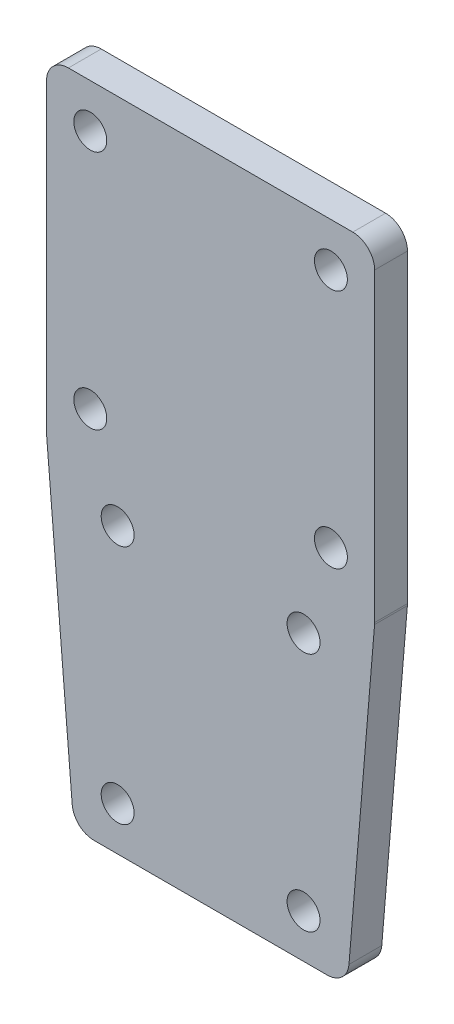
ISO-10303-21;
HEADER;
FILE_DESCRIPTION(('STEP AP214'),'2;1');
FILE_NAME('part.step','',(''),(''),'','','');
FILE_SCHEMA(('AUTOMOTIVE_DESIGN { 1 0 10303 214 1 1 1 1 }'));
ENDSEC;
DATA;
#1=APPLICATION_CONTEXT('core data for automotive mechanical design processes');
#2=APPLICATION_PROTOCOL_DEFINITION('international standard','automotive_design',2000,#1);
#3=PRODUCT_CONTEXT('',#1,'mechanical');
#4=PRODUCT('Part','Part','',(#3));
#5=PRODUCT_RELATED_PRODUCT_CATEGORY('part','',(#4));
#6=PRODUCT_DEFINITION_FORMATION('','',#4);
#7=PRODUCT_DEFINITION_CONTEXT('part definition',#1,'design');
#8=PRODUCT_DEFINITION('design','',#6,#7);
#9=PRODUCT_DEFINITION_SHAPE('','',#8);
#10=(LENGTH_UNIT() NAMED_UNIT(*) SI_UNIT(.MILLI.,.METRE.));
#11=(NAMED_UNIT(*) PLANE_ANGLE_UNIT() SI_UNIT($,.RADIAN.));
#12=(NAMED_UNIT(*) SI_UNIT($,.STERADIAN.) SOLID_ANGLE_UNIT());
#13=UNCERTAINTY_MEASURE_WITH_UNIT(LENGTH_MEASURE(1.E-05),#10,'distance_accuracy_value','');
#14=(GEOMETRIC_REPRESENTATION_CONTEXT(3) GLOBAL_UNCERTAINTY_ASSIGNED_CONTEXT((#13)) GLOBAL_UNIT_ASSIGNED_CONTEXT((#10,
#11,#12)) REPRESENTATION_CONTEXT('',''));
#15=CARTESIAN_POINT('',(0.,0.,0.));
#16=DIRECTION('',(0.,0.,1.));
#17=DIRECTION('',(1.,0.,0.));
#18=AXIS2_PLACEMENT_3D('',#15,#16,#17);
#19=CARTESIAN_POINT('',(0.,-45.,1.5));
#20=DIRECTION('',(0.,1.,0.));
#21=DIRECTION('',(0.,0.,1.));
#22=AXIS2_PLACEMENT_3D('',#19,#20,#21);
#23=PLANE('',#22);
#24=DIRECTION('',(1.,0.,0.));
#25=VECTOR('',#24,1.);
#26=CARTESIAN_POINT('',(0.,-45.,-1.5));
#27=LINE('',#26,#25);
#28=CARTESIAN_POINT('',(-10.659734236868,-45.,-1.5));
#29=VERTEX_POINT('',#28);
#30=CARTESIAN_POINT('',(10.659734236868,-45.,-1.5));
#31=VERTEX_POINT('',#30);
#32=EDGE_CURVE('E132',#29,#31,#27,.T.);
#33=ORIENTED_EDGE('',*,*,#32,.T.);
#34=DIRECTION('',(0.,0.,-1.));
#35=VECTOR('',#34,1.);
#36=CARTESIAN_POINT('',(10.659734236868,-45.,1.5));
#37=LINE('',#36,#35);
#38=CARTESIAN_POINT('',(10.659734236868,-45.,1.5));
#39=VERTEX_POINT('',#38);
#40=EDGE_CURVE('E11',#31,#39,#37,.F.);
#41=ORIENTED_EDGE('',*,*,#40,.T.);
#42=DIRECTION('',(1.,0.,0.));
#43=VECTOR('',#42,1.);
#44=CARTESIAN_POINT('',(0.,-45.,1.5));
#45=LINE('',#44,#43);
#46=CARTESIAN_POINT('',(-10.659734236868,-45.,1.5));
#47=VERTEX_POINT('',#46);
#48=EDGE_CURVE('E202',#47,#39,#45,.T.);
#49=ORIENTED_EDGE('',*,*,#48,.F.);
#50=DIRECTION('',(0.,0.,-1.));
#51=VECTOR('',#50,1.);
#52=CARTESIAN_POINT('',(-10.659734236868,-45.,-1.5));
#53=LINE('',#52,#51);
#54=EDGE_CURVE('E45',#47,#29,#53,.T.);
#55=ORIENTED_EDGE('',*,*,#54,.T.);
#56=EDGE_LOOP('',(#33,#41,#49,#55));
#57=FACE_BOUND('',#56,.T.);
#58=ADVANCED_FACE('F37',(#57),#23,.F.);
#59=CARTESIAN_POINT('',(15.,0.,1.5));
#60=DIRECTION('',(-1.,0.,0.));
#61=DIRECTION('',(0.,0.,1.));
#62=AXIS2_PLACEMENT_3D('',#59,#60,#61);
#63=PLANE('',#62);
#64=DIRECTION('',(0.,1.,0.));
#65=VECTOR('',#64,1.);
#66=CARTESIAN_POINT('',(15.,0.,-1.5));
#67=LINE('',#66,#65);
#68=CARTESIAN_POINT('',(15.,-14.9168108424154,-1.5));
#69=VERTEX_POINT('',#68);
#70=CARTESIAN_POINT('',(15.,13.,-1.5));
#71=VERTEX_POINT('',#70);
#72=EDGE_CURVE('E213',#69,#71,#67,.T.);
#73=ORIENTED_EDGE('',*,*,#72,.T.);
#74=DIRECTION('',(0.,0.,-1.));
#75=VECTOR('',#74,1.);
#76=CARTESIAN_POINT('',(15.,13.,1.5));
#77=LINE('',#76,#75);
#78=CARTESIAN_POINT('',(15.,13.,1.5));
#79=VERTEX_POINT('',#78);
#80=EDGE_CURVE('E192',#71,#79,#77,.F.);
#81=ORIENTED_EDGE('',*,*,#80,.T.);
#82=DIRECTION('',(0.,1.,0.));
#83=VECTOR('',#82,1.);
#84=CARTESIAN_POINT('',(15.,0.,1.5));
#85=LINE('',#84,#83);
#86=CARTESIAN_POINT('',(15.,-14.9168108424154,1.5));
#87=VERTEX_POINT('',#86);
#88=EDGE_CURVE('E204',#87,#79,#85,.T.);
#89=ORIENTED_EDGE('',*,*,#88,.F.);
#90=DIRECTION('',(0.,0.,-1.));
#91=VECTOR('',#90,1.);
#92=CARTESIAN_POINT('',(15.,-14.9168108424154,-1.5));
#93=LINE('',#92,#91);
#94=EDGE_CURVE('E189',#87,#69,#93,.T.);
#95=ORIENTED_EDGE('',*,*,#94,.T.);
#96=EDGE_LOOP('',(#73,#81,#89,#95));
#97=FACE_BOUND('',#96,.T.);
#98=ADVANCED_FACE('F323',(#97),#63,.F.);
#99=CARTESIAN_POINT('',(0.,15.,1.5));
#100=DIRECTION('',(0.,1.,0.));
#101=DIRECTION('',(0.,0.,1.));
#102=AXIS2_PLACEMENT_3D('',#99,#100,#101);
#103=PLANE('',#102);
#104=DIRECTION('',(1.,0.,0.));
#105=VECTOR('',#104,1.);
#106=CARTESIAN_POINT('',(0.,15.,-1.5));
#107=LINE('',#106,#105);
#108=CARTESIAN_POINT('',(-13.,15.,-1.5));
#109=VERTEX_POINT('',#108);
#110=CARTESIAN_POINT('',(13.,15.,-1.5));
#111=VERTEX_POINT('',#110);
#112=EDGE_CURVE('E208',#109,#111,#107,.T.);
#113=ORIENTED_EDGE('',*,*,#112,.F.);
#114=DIRECTION('',(0.,0.,-1.));
#115=VECTOR('',#114,1.);
#116=CARTESIAN_POINT('',(-13.,15.,1.5));
#117=LINE('',#116,#115);
#118=CARTESIAN_POINT('',(-13.,15.,1.5));
#119=VERTEX_POINT('',#118);
#120=EDGE_CURVE('E59',#109,#119,#117,.F.);
#121=ORIENTED_EDGE('',*,*,#120,.T.);
#122=DIRECTION('',(1.,0.,0.));
#123=VECTOR('',#122,1.);
#124=CARTESIAN_POINT('',(0.,15.,1.5));
#125=LINE('',#124,#123);
#126=CARTESIAN_POINT('',(13.,15.,1.5));
#127=VERTEX_POINT('',#126);
#128=EDGE_CURVE('E155',#119,#127,#125,.T.);
#129=ORIENTED_EDGE('',*,*,#128,.T.);
#130=DIRECTION('',(0.,0.,-1.));
#131=VECTOR('',#130,1.);
#132=CARTESIAN_POINT('',(13.,15.,-1.5));
#133=LINE('',#132,#131);
#134=EDGE_CURVE('E185',#127,#111,#133,.T.);
#135=ORIENTED_EDGE('',*,*,#134,.T.);
#136=EDGE_LOOP('',(#113,#121,#129,#135));
#137=FACE_BOUND('',#136,.T.);
#138=ADVANCED_FACE('F217',(#137),#103,.T.);
#139=CARTESIAN_POINT('',(-15.,0.,1.5));
#140=DIRECTION('',(-1.,0.,0.));
#141=DIRECTION('',(0.,0.,1.));
#142=AXIS2_PLACEMENT_3D('',#139,#140,#141);
#143=PLANE('',#142);
#144=DIRECTION('',(0.,1.,0.));
#145=VECTOR('',#144,1.);
#146=CARTESIAN_POINT('',(-15.,0.,-1.5));
#147=LINE('',#146,#145);
#148=CARTESIAN_POINT('',(-15.,-14.9168108424154,-1.5));
#149=VERTEX_POINT('',#148);
#150=CARTESIAN_POINT('',(-15.,13.,-1.5));
#151=VERTEX_POINT('',#150);
#152=EDGE_CURVE('E158',#149,#151,#147,.T.);
#153=ORIENTED_EDGE('',*,*,#152,.F.);
#154=DIRECTION('',(0.,0.,-1.));
#155=VECTOR('',#154,1.);
#156=CARTESIAN_POINT('',(-15.,-14.9168108424154,1.5));
#157=LINE('',#156,#155);
#158=CARTESIAN_POINT('',(-15.,-14.9168108424154,1.5));
#159=VERTEX_POINT('',#158);
#160=EDGE_CURVE('E173',#149,#159,#157,.F.);
#161=ORIENTED_EDGE('',*,*,#160,.T.);
#162=DIRECTION('',(0.,1.,0.));
#163=VECTOR('',#162,1.);
#164=CARTESIAN_POINT('',(-15.,0.,1.5));
#165=LINE('',#164,#163);
#166=CARTESIAN_POINT('',(-15.,13.,1.5));
#167=VERTEX_POINT('',#166);
#168=EDGE_CURVE('E151',#159,#167,#165,.T.);
#169=ORIENTED_EDGE('',*,*,#168,.T.);
#170=DIRECTION('',(0.,0.,-1.));
#171=VECTOR('',#170,1.);
#172=CARTESIAN_POINT('',(-15.,13.,1.5));
#173=LINE('',#172,#171);
#174=EDGE_CURVE('E170',#167,#151,#173,.T.);
#175=ORIENTED_EDGE('',*,*,#174,.T.);
#176=EDGE_LOOP('',(#153,#161,#169,#175));
#177=FACE_BOUND('',#176,.T.);
#178=ADVANCED_FACE('F228',(#177),#143,.T.);
#179=CARTESIAN_POINT('',(0.,0.,1.5));
#180=DIRECTION('',(0.,0.,1.));
#181=DIRECTION('',(1.,0.,0.));
#182=AXIS2_PLACEMENT_3D('',#179,#180,#181);
#183=PLANE('',#182);
#184=CARTESIAN_POINT('',(-11.,11.,1.5));
#185=DIRECTION('',(0.,0.,1.));
#186=DIRECTION('',(1.,0.,0.));
#187=AXIS2_PLACEMENT_3D('',#184,#185,#186);
#188=CIRCLE('',#187,1.505);
#189=CARTESIAN_POINT('',(-9.495,11.,1.5));
#190=VERTEX_POINT('',#189);
#191=EDGE_CURVE('E269',#190,#190,#188,.F.);
#192=ORIENTED_EDGE('',*,*,#191,.T.);
#193=EDGE_LOOP('',(#192));
#194=FACE_BOUND('',#193,.T.);
#195=CARTESIAN_POINT('',(11.,-11.,1.5));
#196=DIRECTION('',(0.,0.,1.));
#197=DIRECTION('',(1.,0.,0.));
#198=AXIS2_PLACEMENT_3D('',#195,#196,#197);
#199=CIRCLE('',#198,1.505);
#200=CARTESIAN_POINT('',(12.505,-11.,1.5));
#201=VERTEX_POINT('',#200);
#202=EDGE_CURVE('E270',#201,#201,#199,.F.);
#203=ORIENTED_EDGE('',*,*,#202,.T.);
#204=EDGE_LOOP('',(#203));
#205=FACE_BOUND('',#204,.T.);
#206=CARTESIAN_POINT('',(-11.,-11.,1.5));
#207=DIRECTION('',(0.,0.,1.));
#208=DIRECTION('',(1.,0.,0.));
#209=AXIS2_PLACEMENT_3D('',#206,#207,#208);
#210=CIRCLE('',#209,1.505);
#211=CARTESIAN_POINT('',(-9.495,-11.,1.5));
#212=VERTEX_POINT('',#211);
#213=EDGE_CURVE('E277',#212,#212,#210,.F.);
#214=ORIENTED_EDGE('',*,*,#213,.T.);
#215=EDGE_LOOP('',(#214));
#216=FACE_BOUND('',#215,.T.);
#217=CARTESIAN_POINT('',(11.,11.,1.5));
#218=DIRECTION('',(0.,0.,1.));
#219=DIRECTION('',(1.,0.,0.));
#220=AXIS2_PLACEMENT_3D('',#217,#218,#219);
#221=CIRCLE('',#220,1.505);
#222=CARTESIAN_POINT('',(12.505,11.,1.5));
#223=VERTEX_POINT('',#222);
#224=EDGE_CURVE('E263',#223,#223,#221,.F.);
#225=ORIENTED_EDGE('',*,*,#224,.T.);
#226=EDGE_LOOP('',(#225));
#227=FACE_BOUND('',#226,.T.);
#228=CARTESIAN_POINT('',(-8.5,-19.,1.5));
#229=DIRECTION('',(0.,0.,1.));
#230=DIRECTION('',(1.,0.,0.));
#231=AXIS2_PLACEMENT_3D('',#228,#229,#230);
#232=CIRCLE('',#231,1.505);
#233=CARTESIAN_POINT('',(-10.005,-19.,1.5));
#234=VERTEX_POINT('',#233);
#235=EDGE_CURVE('E245',#234,#234,#232,.F.);
#236=ORIENTED_EDGE('',*,*,#235,.T.);
#237=EDGE_LOOP('',(#236));
#238=FACE_BOUND('',#237,.T.);
#239=CARTESIAN_POINT('',(8.49999999999999,-41.,1.5));
#240=DIRECTION('',(0.,0.,1.));
#241=DIRECTION('',(1.,0.,0.));
#242=AXIS2_PLACEMENT_3D('',#239,#240,#241);
#243=CIRCLE('',#242,1.505);
#244=CARTESIAN_POINT('',(6.99499999999999,-41.,1.5));
#245=VERTEX_POINT('',#244);
#246=EDGE_CURVE('E246',#245,#245,#243,.F.);
#247=ORIENTED_EDGE('',*,*,#246,.T.);
#248=EDGE_LOOP('',(#247));
#249=FACE_BOUND('',#248,.T.);
#250=CARTESIAN_POINT('',(-8.5,-41.,1.5));
#251=DIRECTION('',(0.,0.,1.));
#252=DIRECTION('',(1.,0.,0.));
#253=AXIS2_PLACEMENT_3D('',#250,#251,#252);
#254=CIRCLE('',#253,1.505);
#255=CARTESIAN_POINT('',(-10.005,-41.,1.5));
#256=VERTEX_POINT('',#255);
#257=EDGE_CURVE('E253',#256,#256,#254,.F.);
#258=ORIENTED_EDGE('',*,*,#257,.T.);
#259=EDGE_LOOP('',(#258));
#260=FACE_BOUND('',#259,.T.);
#261=CARTESIAN_POINT('',(8.5,-19.,1.5));
#262=DIRECTION('',(0.,0.,1.));
#263=DIRECTION('',(1.,0.,0.));
#264=AXIS2_PLACEMENT_3D('',#261,#262,#263);
#265=CIRCLE('',#264,1.505);
#266=CARTESIAN_POINT('',(6.995,-19.,1.5));
#267=VERTEX_POINT('',#266);
#268=EDGE_CURVE('E234',#267,#267,#265,.F.);
#269=ORIENTED_EDGE('',*,*,#268,.T.);
#270=EDGE_LOOP('',(#269));
#271=FACE_BOUND('',#270,.T.);
#272=ORIENTED_EDGE('',*,*,#168,.F.);
#273=CARTESIAN_POINT('',(-13.,-14.9168108424154,1.5));
#274=DIRECTION('',(0.,0.,1.));
#275=DIRECTION('',(1.,0.,0.));
#276=AXIS2_PLACEMENT_3D('',#273,#274,#275);
#277=CIRCLE('',#276,2.);
#278=CARTESIAN_POINT('',(-14.9930915164898,-15.0829018021229,1.5));
#279=VERTEX_POINT('',#278);
#280=EDGE_CURVE('E183',#159,#279,#277,.T.);
#281=ORIENTED_EDGE('',*,*,#280,.T.);
#282=DIRECTION('',(0.0830454798537399,-0.99654575824488,0.));
#283=VECTOR('',#282,1.);
#284=CARTESIAN_POINT('',(-15.,-15.,1.5));
#285=LINE('',#284,#283);
#286=CARTESIAN_POINT('',(-12.6528257533577,-43.1660909597075,1.5));
#287=VERTEX_POINT('',#286);
#288=EDGE_CURVE('E232',#279,#287,#285,.T.);
#289=ORIENTED_EDGE('',*,*,#288,.T.);
#290=CARTESIAN_POINT('',(-10.659734236868,-43.,1.5));
#291=DIRECTION('',(0.,0.,1.));
#292=DIRECTION('',(1.,0.,0.));
#293=AXIS2_PLACEMENT_3D('',#290,#291,#292);
#294=CIRCLE('',#293,2.);
#295=EDGE_CURVE('E150',#287,#47,#294,.T.);
#296=ORIENTED_EDGE('',*,*,#295,.T.);
#297=ORIENTED_EDGE('',*,*,#48,.T.);
#298=CARTESIAN_POINT('',(10.659734236868,-43.,1.5));
#299=DIRECTION('',(0.,0.,1.));
#300=DIRECTION('',(1.,0.,0.));
#301=AXIS2_PLACEMENT_3D('',#298,#299,#300);
#302=CIRCLE('',#301,2.);
#303=CARTESIAN_POINT('',(12.6528257533577,-43.1660909597075,1.5));
#304=VERTEX_POINT('',#303);
#305=EDGE_CURVE('E176',#39,#304,#302,.T.);
#306=ORIENTED_EDGE('',*,*,#305,.T.);
#307=DIRECTION('',(0.0830454798537399,0.99654575824488,0.));
#308=VECTOR('',#307,1.);
#309=CARTESIAN_POINT('',(12.5,-45.,1.5));
#310=LINE('',#309,#308);
#311=CARTESIAN_POINT('',(14.9930915164898,-15.0829018021229,1.5));
#312=VERTEX_POINT('',#311);
#313=EDGE_CURVE('E233',#304,#312,#310,.T.);
#314=ORIENTED_EDGE('',*,*,#313,.T.);
#315=CARTESIAN_POINT('',(13.,-14.9168108424154,1.5));
#316=DIRECTION('',(0.,0.,1.));
#317=DIRECTION('',(1.,0.,0.));
#318=AXIS2_PLACEMENT_3D('',#315,#316,#317);
#319=CIRCLE('',#318,2.);
#320=EDGE_CURVE('E178',#312,#87,#319,.T.);
#321=ORIENTED_EDGE('',*,*,#320,.T.);
#322=ORIENTED_EDGE('',*,*,#88,.T.);
#323=CARTESIAN_POINT('',(13.,13.,1.5));
#324=DIRECTION('',(0.,0.,1.));
#325=DIRECTION('',(1.,0.,0.));
#326=AXIS2_PLACEMENT_3D('',#323,#324,#325);
#327=CIRCLE('',#326,2.);
#328=EDGE_CURVE('E52',#79,#127,#327,.T.);
#329=ORIENTED_EDGE('',*,*,#328,.T.);
#330=ORIENTED_EDGE('',*,*,#128,.F.);
#331=CARTESIAN_POINT('',(-13.,13.,1.5));
#332=DIRECTION('',(0.,0.,1.));
#333=DIRECTION('',(1.,0.,0.));
#334=AXIS2_PLACEMENT_3D('',#331,#332,#333);
#335=CIRCLE('',#334,2.);
#336=EDGE_CURVE('E181',#119,#167,#335,.T.);
#337=ORIENTED_EDGE('',*,*,#336,.T.);
#338=EDGE_LOOP('',(#272,#281,#289,#296,#297,#306,#314,#321,#322,#329,#330,#337));
#339=FACE_BOUND('',#338,.T.);
#340=ADVANCED_FACE('F224',(#194,#205,#216,#227,#238,#249,#260,#271,#339),#183,.T.);
#341=CARTESIAN_POINT('',(0.,0.,-1.5));
#342=DIRECTION('',(0.,0.,1.));
#343=DIRECTION('',(1.,0.,0.));
#344=AXIS2_PLACEMENT_3D('',#341,#342,#343);
#345=PLANE('',#344);
#346=CARTESIAN_POINT('',(-11.,11.,-1.5));
#347=DIRECTION('',(0.,0.,-1.));
#348=DIRECTION('',(-1.,0.,0.));
#349=AXIS2_PLACEMENT_3D('',#346,#347,#348);
#350=CIRCLE('',#349,1.505);
#351=CARTESIAN_POINT('',(-12.505,11.,-1.5));
#352=VERTEX_POINT('',#351);
#353=EDGE_CURVE('E273',#352,#352,#350,.T.);
#354=ORIENTED_EDGE('',*,*,#353,.F.);
#355=EDGE_LOOP('',(#354));
#356=FACE_BOUND('',#355,.T.);
#357=CARTESIAN_POINT('',(11.,-11.,-1.5));
#358=DIRECTION('',(0.,0.,-1.));
#359=DIRECTION('',(-1.,0.,0.));
#360=AXIS2_PLACEMENT_3D('',#357,#358,#359);
#361=CIRCLE('',#360,1.505);
#362=CARTESIAN_POINT('',(9.495,-11.,-1.5));
#363=VERTEX_POINT('',#362);
#364=EDGE_CURVE('E274',#363,#363,#361,.T.);
#365=ORIENTED_EDGE('',*,*,#364,.F.);
#366=EDGE_LOOP('',(#365));
#367=FACE_BOUND('',#366,.T.);
#368=CARTESIAN_POINT('',(-11.,-11.,-1.5));
#369=DIRECTION('',(0.,0.,-1.));
#370=DIRECTION('',(-1.,0.,0.));
#371=AXIS2_PLACEMENT_3D('',#368,#369,#370);
#372=CIRCLE('',#371,1.505);
#373=CARTESIAN_POINT('',(-12.505,-11.,-1.5));
#374=VERTEX_POINT('',#373);
#375=EDGE_CURVE('E284',#374,#374,#372,.T.);
#376=ORIENTED_EDGE('',*,*,#375,.F.);
#377=EDGE_LOOP('',(#376));
#378=FACE_BOUND('',#377,.T.);
#379=CARTESIAN_POINT('',(11.,11.,-1.5));
#380=DIRECTION('',(0.,0.,-1.));
#381=DIRECTION('',(-1.,0.,0.));
#382=AXIS2_PLACEMENT_3D('',#379,#380,#381);
#383=CIRCLE('',#382,1.505);
#384=CARTESIAN_POINT('',(9.495,11.,-1.5));
#385=VERTEX_POINT('',#384);
#386=EDGE_CURVE('E266',#385,#385,#383,.T.);
#387=ORIENTED_EDGE('',*,*,#386,.F.);
#388=EDGE_LOOP('',(#387));
#389=FACE_BOUND('',#388,.T.);
#390=CARTESIAN_POINT('',(-8.5,-19.,-1.5));
#391=DIRECTION('',(0.,0.,-1.));
#392=DIRECTION('',(-1.,0.,0.));
#393=AXIS2_PLACEMENT_3D('',#390,#391,#392);
#394=CIRCLE('',#393,1.505);
#395=CARTESIAN_POINT('',(-10.005,-19.,-1.5));
#396=VERTEX_POINT('',#395);
#397=EDGE_CURVE('E249',#396,#396,#394,.T.);
#398=ORIENTED_EDGE('',*,*,#397,.F.);
#399=EDGE_LOOP('',(#398));
#400=FACE_BOUND('',#399,.T.);
#401=CARTESIAN_POINT('',(8.49999999999999,-41.,-1.5));
#402=DIRECTION('',(0.,0.,-1.));
#403=DIRECTION('',(-1.,0.,0.));
#404=AXIS2_PLACEMENT_3D('',#401,#402,#403);
#405=CIRCLE('',#404,1.505);
#406=CARTESIAN_POINT('',(6.99499999999999,-41.,-1.5));
#407=VERTEX_POINT('',#406);
#408=EDGE_CURVE('E250',#407,#407,#405,.T.);
#409=ORIENTED_EDGE('',*,*,#408,.F.);
#410=EDGE_LOOP('',(#409));
#411=FACE_BOUND('',#410,.T.);
#412=CARTESIAN_POINT('',(-8.5,-41.,-1.5));
#413=DIRECTION('',(0.,0.,-1.));
#414=DIRECTION('',(-1.,0.,0.));
#415=AXIS2_PLACEMENT_3D('',#412,#413,#414);
#416=CIRCLE('',#415,1.505);
#417=CARTESIAN_POINT('',(-10.005,-41.,-1.5));
#418=VERTEX_POINT('',#417);
#419=EDGE_CURVE('E260',#418,#418,#416,.T.);
#420=ORIENTED_EDGE('',*,*,#419,.F.);
#421=EDGE_LOOP('',(#420));
#422=FACE_BOUND('',#421,.T.);
#423=CARTESIAN_POINT('',(8.5,-19.,-1.5));
#424=DIRECTION('',(0.,0.,-1.));
#425=DIRECTION('',(-1.,0.,0.));
#426=AXIS2_PLACEMENT_3D('',#423,#424,#425);
#427=CIRCLE('',#426,1.505);
#428=CARTESIAN_POINT('',(6.995,-19.,-1.5));
#429=VERTEX_POINT('',#428);
#430=EDGE_CURVE('E238',#429,#429,#427,.T.);
#431=ORIENTED_EDGE('',*,*,#430,.F.);
#432=EDGE_LOOP('',(#431));
#433=FACE_BOUND('',#432,.T.);
#434=DIRECTION('',(-0.0830454798537399,0.99654575824488,0.));
#435=VECTOR('',#434,1.);
#436=CARTESIAN_POINT('',(-15.,-15.,-1.5));
#437=LINE('',#436,#435);
#438=CARTESIAN_POINT('',(-12.6528257533577,-43.1660909597075,-1.5));
#439=VERTEX_POINT('',#438);
#440=CARTESIAN_POINT('',(-14.9930915164898,-15.0829018021229,-1.5));
#441=VERTEX_POINT('',#440);
#442=EDGE_CURVE('E130',#439,#441,#437,.T.);
#443=ORIENTED_EDGE('',*,*,#442,.T.);
#444=CARTESIAN_POINT('',(-13.,-14.9168108424154,-1.5));
#445=DIRECTION('',(0.,0.,1.));
#446=DIRECTION('',(1.,0.,0.));
#447=AXIS2_PLACEMENT_3D('',#444,#445,#446);
#448=CIRCLE('',#447,2.);
#449=EDGE_CURVE('E168',#441,#149,#448,.F.);
#450=ORIENTED_EDGE('',*,*,#449,.T.);
#451=ORIENTED_EDGE('',*,*,#152,.T.);
#452=CARTESIAN_POINT('',(-13.,13.,-1.5));
#453=DIRECTION('',(0.,0.,1.));
#454=DIRECTION('',(1.,0.,0.));
#455=AXIS2_PLACEMENT_3D('',#452,#453,#454);
#456=CIRCLE('',#455,2.);
#457=EDGE_CURVE('E166',#151,#109,#456,.F.);
#458=ORIENTED_EDGE('',*,*,#457,.T.);
#459=ORIENTED_EDGE('',*,*,#112,.T.);
#460=CARTESIAN_POINT('',(13.,13.,-1.5));
#461=DIRECTION('',(0.,0.,1.));
#462=DIRECTION('',(1.,0.,0.));
#463=AXIS2_PLACEMENT_3D('',#460,#461,#462);
#464=CIRCLE('',#463,2.);
#465=EDGE_CURVE('E164',#111,#71,#464,.F.);
#466=ORIENTED_EDGE('',*,*,#465,.T.);
#467=ORIENTED_EDGE('',*,*,#72,.F.);
#468=CARTESIAN_POINT('',(13.,-14.9168108424154,-1.5));
#469=DIRECTION('',(0.,0.,1.));
#470=DIRECTION('',(1.,0.,0.));
#471=AXIS2_PLACEMENT_3D('',#468,#469,#470);
#472=CIRCLE('',#471,2.);
#473=CARTESIAN_POINT('',(14.9930915164898,-15.0829018021229,-1.5));
#474=VERTEX_POINT('',#473);
#475=EDGE_CURVE('E162',#69,#474,#472,.F.);
#476=ORIENTED_EDGE('',*,*,#475,.T.);
#477=DIRECTION('',(-0.0830454798537399,-0.99654575824488,0.));
#478=VECTOR('',#477,1.);
#479=CARTESIAN_POINT('',(12.5,-45.,-1.5));
#480=LINE('',#479,#478);
#481=CARTESIAN_POINT('',(12.6528257533577,-43.1660909597075,-1.5));
#482=VERTEX_POINT('',#481);
#483=EDGE_CURVE('E147',#474,#482,#480,.T.);
#484=ORIENTED_EDGE('',*,*,#483,.T.);
#485=CARTESIAN_POINT('',(10.659734236868,-43.,-1.5));
#486=DIRECTION('',(0.,0.,1.));
#487=DIRECTION('',(1.,0.,0.));
#488=AXIS2_PLACEMENT_3D('',#485,#486,#487);
#489=CIRCLE('',#488,2.);
#490=EDGE_CURVE('E137',#482,#31,#489,.F.);
#491=ORIENTED_EDGE('',*,*,#490,.T.);
#492=ORIENTED_EDGE('',*,*,#32,.F.);
#493=CARTESIAN_POINT('',(-10.659734236868,-43.,-1.5));
#494=DIRECTION('',(0.,0.,1.));
#495=DIRECTION('',(1.,0.,0.));
#496=AXIS2_PLACEMENT_3D('',#493,#494,#495);
#497=CIRCLE('',#496,2.);
#498=EDGE_CURVE('E127',#29,#439,#497,.F.);
#499=ORIENTED_EDGE('',*,*,#498,.T.);
#500=EDGE_LOOP('',(#443,#450,#451,#458,#459,#466,#467,#476,#484,#491,#492,#499));
#501=FACE_BOUND('',#500,.T.);
#502=ADVANCED_FACE('F129',(#356,#367,#378,#389,#400,#411,#422,#433,#501),#345,.F.);
#503=CARTESIAN_POINT('',(-15.,-15.,-43.9264068711929));
#504=DIRECTION('',(-0.99654575824488,-0.0830454798537399,0.));
#505=DIRECTION('',(0.0830454798537399,-0.99654575824488,0.));
#506=AXIS2_PLACEMENT_3D('',#503,#504,#505);
#507=PLANE('',#506);
#508=ORIENTED_EDGE('',*,*,#288,.F.);
#509=DIRECTION('',(0.,0.,-1.));
#510=VECTOR('',#509,1.);
#511=CARTESIAN_POINT('',(-14.9930915164898,-15.0829018021229,-43.9264068711929));
#512=LINE('',#511,#510);
#513=EDGE_CURVE('E138',#279,#441,#512,.T.);
#514=ORIENTED_EDGE('',*,*,#513,.T.);
#515=ORIENTED_EDGE('',*,*,#442,.F.);
#516=DIRECTION('',(0.,0.,-1.));
#517=VECTOR('',#516,1.);
#518=CARTESIAN_POINT('',(-12.6528257533577,-43.1660909597075,1.5));
#519=LINE('',#518,#517);
#520=EDGE_CURVE('E144',#439,#287,#519,.F.);
#521=ORIENTED_EDGE('',*,*,#520,.T.);
#522=EDGE_LOOP('',(#508,#514,#515,#521));
#523=FACE_BOUND('',#522,.T.);
#524=ADVANCED_FACE('F143',(#523),#507,.T.);
#525=CARTESIAN_POINT('',(12.5,-45.,-43.9264068711929));
#526=DIRECTION('',(0.99654575824488,-0.0830454798537399,0.));
#527=DIRECTION('',(0.0830454798537399,0.99654575824488,0.));
#528=AXIS2_PLACEMENT_3D('',#525,#526,#527);
#529=PLANE('',#528);
#530=ORIENTED_EDGE('',*,*,#483,.F.);
#531=DIRECTION('',(0.,0.,-1.));
#532=VECTOR('',#531,1.);
#533=CARTESIAN_POINT('',(14.9930915164898,-15.0829018021229,1.5));
#534=LINE('',#533,#532);
#535=EDGE_CURVE('E197',#474,#312,#534,.F.);
#536=ORIENTED_EDGE('',*,*,#535,.T.);
#537=ORIENTED_EDGE('',*,*,#313,.F.);
#538=DIRECTION('',(0.,0.,-1.));
#539=VECTOR('',#538,1.);
#540=CARTESIAN_POINT('',(12.6528257533577,-43.1660909597075,-1.5));
#541=LINE('',#540,#539);
#542=EDGE_CURVE('E194',#304,#482,#541,.T.);
#543=ORIENTED_EDGE('',*,*,#542,.T.);
#544=EDGE_LOOP('',(#530,#536,#537,#543));
#545=FACE_BOUND('',#544,.T.);
#546=ADVANCED_FACE('F309',(#545),#529,.T.);
#547=CARTESIAN_POINT('',(8.5,-19.,5.75678282274303));
#548=DIRECTION('',(0.,0.,-1.));
#549=DIRECTION('',(-1.,0.,0.));
#550=AXIS2_PLACEMENT_3D('',#547,#548,#549);
#551=CYLINDRICAL_SURFACE('',#550,1.505);
#552=CARTESIAN_POINT('',(6.995,-19.,-1.5));
#553=CARTESIAN_POINT('',(6.995,-19.,-1.46875));
#554=CARTESIAN_POINT('',(6.995,-19.,-1.4375));
#555=CARTESIAN_POINT('',(6.995,-19.,-1.375));
#556=CARTESIAN_POINT('',(6.995,-19.,-1.34375));
#557=CARTESIAN_POINT('',(6.995,-19.,-1.28125));
#558=CARTESIAN_POINT('',(6.995,-19.,-1.25));
#559=CARTESIAN_POINT('',(6.995,-19.,-1.1875));
#560=CARTESIAN_POINT('',(6.995,-19.,-1.15625));
#561=CARTESIAN_POINT('',(6.995,-19.,-1.09375));
#562=CARTESIAN_POINT('',(6.995,-19.,-1.0625));
#563=CARTESIAN_POINT('',(6.995,-19.,-1.));
#564=CARTESIAN_POINT('',(6.995,-19.,-0.968750000000001));
#565=CARTESIAN_POINT('',(6.995,-19.,-0.906250000000001));
#566=CARTESIAN_POINT('',(6.995,-19.,-0.875000000000001));
#567=CARTESIAN_POINT('',(6.995,-19.,-0.812500000000001));
#568=CARTESIAN_POINT('',(6.995,-19.,-0.781250000000001));
#569=CARTESIAN_POINT('',(6.995,-19.,-0.718750000000001));
#570=CARTESIAN_POINT('',(6.995,-19.,-0.687500000000001));
#571=CARTESIAN_POINT('',(6.995,-19.,-0.625000000000001));
#572=CARTESIAN_POINT('',(6.995,-19.,-0.593750000000001));
#573=CARTESIAN_POINT('',(6.995,-19.,-0.531250000000001));
#574=CARTESIAN_POINT('',(6.995,-19.,-0.500000000000001));
#575=CARTESIAN_POINT('',(6.995,-19.,-0.437500000000001));
#576=CARTESIAN_POINT('',(6.995,-19.,-0.406250000000001));
#577=CARTESIAN_POINT('',(6.995,-19.,-0.343750000000001));
#578=CARTESIAN_POINT('',(6.995,-19.,-0.312500000000001));
#579=CARTESIAN_POINT('',(6.995,-19.,-0.250000000000001));
#580=CARTESIAN_POINT('',(6.995,-19.,-0.218750000000001));
#581=CARTESIAN_POINT('',(6.995,-19.,-0.156250000000001));
#582=CARTESIAN_POINT('',(6.995,-19.,-0.125000000000001));
#583=CARTESIAN_POINT('',(6.995,-19.,-0.0625000000000009));
#584=CARTESIAN_POINT('',(6.995,-19.,-0.0312500000000009));
#585=CARTESIAN_POINT('',(6.995,-19.,0.0312499999999992));
#586=CARTESIAN_POINT('',(6.995,-19.,0.0624999999999992));
#587=CARTESIAN_POINT('',(6.995,-19.,0.124999999999999));
#588=CARTESIAN_POINT('',(6.995,-19.,0.156249999999999));
#589=CARTESIAN_POINT('',(6.995,-19.,0.218749999999999));
#590=CARTESIAN_POINT('',(6.995,-19.,0.249999999999999));
#591=CARTESIAN_POINT('',(6.995,-19.,0.312499999999999));
#592=CARTESIAN_POINT('',(6.995,-19.,0.343749999999999));
#593=CARTESIAN_POINT('',(6.995,-19.,0.40625));
#594=CARTESIAN_POINT('',(6.995,-19.,0.4375));
#595=CARTESIAN_POINT('',(6.995,-19.,0.499999999999999));
#596=CARTESIAN_POINT('',(6.995,-19.,0.531249999999999));
#597=CARTESIAN_POINT('',(6.995,-19.,0.593749999999999));
#598=CARTESIAN_POINT('',(6.995,-19.,0.624999999999999));
#599=CARTESIAN_POINT('',(6.995,-19.,0.687499999999999));
#600=CARTESIAN_POINT('',(6.995,-19.,0.718749999999999));
#601=CARTESIAN_POINT('',(6.995,-19.,0.781249999999999));
#602=CARTESIAN_POINT('',(6.995,-19.,0.812499999999999));
#603=CARTESIAN_POINT('',(6.995,-19.,0.874999999999999));
#604=CARTESIAN_POINT('',(6.995,-19.,0.906249999999999));
#605=CARTESIAN_POINT('',(6.995,-19.,0.968749999999999));
#606=CARTESIAN_POINT('',(6.995,-19.,0.999999999999999));
#607=CARTESIAN_POINT('',(6.995,-19.,1.0625));
#608=CARTESIAN_POINT('',(6.995,-19.,1.09375));
#609=CARTESIAN_POINT('',(6.995,-19.,1.15625));
#610=CARTESIAN_POINT('',(6.995,-19.,1.1875));
#611=CARTESIAN_POINT('',(6.995,-19.,1.25));
#612=CARTESIAN_POINT('',(6.995,-19.,1.28125));
#613=CARTESIAN_POINT('',(6.995,-19.,1.34375));
#614=CARTESIAN_POINT('',(6.995,-19.,1.375));
#615=CARTESIAN_POINT('',(6.995,-19.,1.4375));
#616=CARTESIAN_POINT('',(6.995,-19.,1.46875));
#617=CARTESIAN_POINT('',(6.995,-19.,1.5));
#618=B_SPLINE_CURVE_WITH_KNOTS('',3,(#552,#553,#554,#555,#556,#557,#558,#559,#560,#561,#562,
#563,#564,#565,#566,#567,#568,#569,#570,#571,#572,#573,#574,#575,#576,#577,#578,#579,#580,#581,
#582,#583,#584,#585,#586,#587,#588,#589,#590,#591,#592,#593,#594,#595,#596,#597,#598,#599,#600,
#601,#602,#603,#604,#605,#606,#607,#608,#609,#610,#611,#612,#613,#614,#615,#616,#617),
.UNSPECIFIED.,.F.,.F.,(4,2,2,2,2,2,2,2,2,2,2,2,2,2,2,2,2,2,2,2,2,2,2,2,2,2,2,2,2,2,2,2,4),(0.,
0.0937500000000001,0.1875,0.28125,0.375,0.46875,0.5625,0.65625,0.75,0.84375,0.9375,1.03125,
1.125,1.21875,1.3125,1.40625,1.5,1.59375,1.6875,1.78125,1.875,1.96875,2.0625,2.15625,2.25,
2.34375,2.4375,2.53125,2.625,2.71875,2.8125,2.90625,3.),.UNSPECIFIED.);
#619=EDGE_CURVE('BSEAM305',#429,#267,#618,.T.);
#620=ORIENTED_EDGE('',*,*,#430,.T.);
#621=ORIENTED_EDGE('',*,*,#268,.F.);
#622=ORIENTED_EDGE('',*,*,#619,.T.);
#623=ORIENTED_EDGE('',*,*,#619,.F.);
#624=EDGE_LOOP('',(#620,#622,#621,#623));
#625=FACE_BOUND('',#624,.T.);
#626=ADVANCED_FACE('F305',(#625),#551,.F.);
#627=CARTESIAN_POINT('',(-8.5,-41.,5.75678282274303));
#628=DIRECTION('',(0.,0.,-1.));
#629=DIRECTION('',(-1.,0.,0.));
#630=AXIS2_PLACEMENT_3D('',#627,#628,#629);
#631=CYLINDRICAL_SURFACE('',#630,1.505);
#632=CARTESIAN_POINT('',(-10.005,-41.,-1.5));
#633=CARTESIAN_POINT('',(-10.005,-41.,-1.46875));
#634=CARTESIAN_POINT('',(-10.005,-41.,-1.4375));
#635=CARTESIAN_POINT('',(-10.005,-41.,-1.375));
#636=CARTESIAN_POINT('',(-10.005,-41.,-1.34375));
#637=CARTESIAN_POINT('',(-10.005,-41.,-1.28125));
#638=CARTESIAN_POINT('',(-10.005,-41.,-1.25));
#639=CARTESIAN_POINT('',(-10.005,-41.,-1.1875));
#640=CARTESIAN_POINT('',(-10.005,-41.,-1.15625));
#641=CARTESIAN_POINT('',(-10.005,-41.,-1.09375));
#642=CARTESIAN_POINT('',(-10.005,-41.,-1.0625));
#643=CARTESIAN_POINT('',(-10.005,-41.,-1.));
#644=CARTESIAN_POINT('',(-10.005,-41.,-0.968750000000001));
#645=CARTESIAN_POINT('',(-10.005,-41.,-0.906250000000001));
#646=CARTESIAN_POINT('',(-10.005,-41.,-0.875000000000001));
#647=CARTESIAN_POINT('',(-10.005,-41.,-0.812500000000001));
#648=CARTESIAN_POINT('',(-10.005,-41.,-0.781250000000001));
#649=CARTESIAN_POINT('',(-10.005,-41.,-0.718750000000001));
#650=CARTESIAN_POINT('',(-10.005,-41.,-0.687500000000001));
#651=CARTESIAN_POINT('',(-10.005,-41.,-0.625000000000001));
#652=CARTESIAN_POINT('',(-10.005,-41.,-0.593750000000001));
#653=CARTESIAN_POINT('',(-10.005,-41.,-0.531250000000001));
#654=CARTESIAN_POINT('',(-10.005,-41.,-0.500000000000001));
#655=CARTESIAN_POINT('',(-10.005,-41.,-0.437500000000001));
#656=CARTESIAN_POINT('',(-10.005,-41.,-0.406250000000001));
#657=CARTESIAN_POINT('',(-10.005,-41.,-0.343750000000001));
#658=CARTESIAN_POINT('',(-10.005,-41.,-0.312500000000001));
#659=CARTESIAN_POINT('',(-10.005,-41.,-0.250000000000001));
#660=CARTESIAN_POINT('',(-10.005,-41.,-0.218750000000001));
#661=CARTESIAN_POINT('',(-10.005,-41.,-0.156250000000001));
#662=CARTESIAN_POINT('',(-10.005,-41.,-0.125000000000001));
#663=CARTESIAN_POINT('',(-10.005,-41.,-0.0625000000000009));
#664=CARTESIAN_POINT('',(-10.005,-41.,-0.0312500000000009));
#665=CARTESIAN_POINT('',(-10.005,-41.,0.0312499999999992));
#666=CARTESIAN_POINT('',(-10.005,-41.,0.0624999999999992));
#667=CARTESIAN_POINT('',(-10.005,-41.,0.124999999999999));
#668=CARTESIAN_POINT('',(-10.005,-41.,0.156249999999999));
#669=CARTESIAN_POINT('',(-10.005,-41.,0.218749999999999));
#670=CARTESIAN_POINT('',(-10.005,-41.,0.249999999999999));
#671=CARTESIAN_POINT('',(-10.005,-41.,0.312499999999999));
#672=CARTESIAN_POINT('',(-10.005,-41.,0.343749999999999));
#673=CARTESIAN_POINT('',(-10.005,-41.,0.40625));
#674=CARTESIAN_POINT('',(-10.005,-41.,0.4375));
#675=CARTESIAN_POINT('',(-10.005,-41.,0.499999999999999));
#676=CARTESIAN_POINT('',(-10.005,-41.,0.531249999999999));
#677=CARTESIAN_POINT('',(-10.005,-41.,0.593749999999999));
#678=CARTESIAN_POINT('',(-10.005,-41.,0.624999999999999));
#679=CARTESIAN_POINT('',(-10.005,-41.,0.687499999999999));
#680=CARTESIAN_POINT('',(-10.005,-41.,0.718749999999999));
#681=CARTESIAN_POINT('',(-10.005,-41.,0.781249999999999));
#682=CARTESIAN_POINT('',(-10.005,-41.,0.812499999999999));
#683=CARTESIAN_POINT('',(-10.005,-41.,0.874999999999999));
#684=CARTESIAN_POINT('',(-10.005,-41.,0.906249999999999));
#685=CARTESIAN_POINT('',(-10.005,-41.,0.968749999999999));
#686=CARTESIAN_POINT('',(-10.005,-41.,0.999999999999999));
#687=CARTESIAN_POINT('',(-10.005,-41.,1.0625));
#688=CARTESIAN_POINT('',(-10.005,-41.,1.09375));
#689=CARTESIAN_POINT('',(-10.005,-41.,1.15625));
#690=CARTESIAN_POINT('',(-10.005,-41.,1.1875));
#691=CARTESIAN_POINT('',(-10.005,-41.,1.25));
#692=CARTESIAN_POINT('',(-10.005,-41.,1.28125));
#693=CARTESIAN_POINT('',(-10.005,-41.,1.34375));
#694=CARTESIAN_POINT('',(-10.005,-41.,1.375));
#695=CARTESIAN_POINT('',(-10.005,-41.,1.4375));
#696=CARTESIAN_POINT('',(-10.005,-41.,1.46875));
#697=CARTESIAN_POINT('',(-10.005,-41.,1.5));
#698=B_SPLINE_CURVE_WITH_KNOTS('',3,(#632,#633,#634,#635,#636,#637,#638,#639,#640,#641,#642,
#643,#644,#645,#646,#647,#648,#649,#650,#651,#652,#653,#654,#655,#656,#657,#658,#659,#660,#661,
#662,#663,#664,#665,#666,#667,#668,#669,#670,#671,#672,#673,#674,#675,#676,#677,#678,#679,#680,
#681,#682,#683,#684,#685,#686,#687,#688,#689,#690,#691,#692,#693,#694,#695,#696,#697),
.UNSPECIFIED.,.F.,.F.,(4,2,2,2,2,2,2,2,2,2,2,2,2,2,2,2,2,2,2,2,2,2,2,2,2,2,2,2,2,2,2,2,4),(0.,
0.0937500000000001,0.1875,0.28125,0.375,0.46875,0.5625,0.65625,0.75,0.84375,0.9375,1.03125,
1.125,1.21875,1.3125,1.40625,1.5,1.59375,1.6875,1.78125,1.875,1.96875,2.0625,2.15625,2.25,
2.34375,2.4375,2.53125,2.625,2.71875,2.8125,2.90625,3.),.UNSPECIFIED.);
#699=EDGE_CURVE('BSEAM308',#418,#256,#698,.T.);
#700=ORIENTED_EDGE('',*,*,#419,.T.);
#701=ORIENTED_EDGE('',*,*,#257,.F.);
#702=ORIENTED_EDGE('',*,*,#699,.T.);
#703=ORIENTED_EDGE('',*,*,#699,.F.);
#704=EDGE_LOOP('',(#700,#702,#701,#703));
#705=FACE_BOUND('',#704,.T.);
#706=ADVANCED_FACE('F308',(#705),#631,.F.);
#707=CARTESIAN_POINT('',(8.49999999999999,-41.,5.75678282274303));
#708=DIRECTION('',(0.,0.,-1.));
#709=DIRECTION('',(-1.,0.,0.));
#710=AXIS2_PLACEMENT_3D('',#707,#708,#709);
#711=CYLINDRICAL_SURFACE('',#710,1.505);
#712=CARTESIAN_POINT('',(6.99499999999999,-41.,-1.5));
#713=CARTESIAN_POINT('',(6.99499999999999,-41.,-1.46875));
#714=CARTESIAN_POINT('',(6.99499999999999,-41.,-1.4375));
#715=CARTESIAN_POINT('',(6.99499999999999,-41.,-1.375));
#716=CARTESIAN_POINT('',(6.99499999999999,-41.,-1.34375));
#717=CARTESIAN_POINT('',(6.99499999999999,-41.,-1.28125));
#718=CARTESIAN_POINT('',(6.99499999999999,-41.,-1.25));
#719=CARTESIAN_POINT('',(6.99499999999999,-41.,-1.1875));
#720=CARTESIAN_POINT('',(6.99499999999999,-41.,-1.15625));
#721=CARTESIAN_POINT('',(6.99499999999999,-41.,-1.09375));
#722=CARTESIAN_POINT('',(6.99499999999999,-41.,-1.0625));
#723=CARTESIAN_POINT('',(6.99499999999999,-41.,-1.));
#724=CARTESIAN_POINT('',(6.99499999999999,-41.,-0.968750000000001));
#725=CARTESIAN_POINT('',(6.99499999999999,-41.,-0.906250000000001));
#726=CARTESIAN_POINT('',(6.99499999999999,-41.,-0.875000000000001));
#727=CARTESIAN_POINT('',(6.99499999999999,-41.,-0.812500000000001));
#728=CARTESIAN_POINT('',(6.99499999999999,-41.,-0.781250000000001));
#729=CARTESIAN_POINT('',(6.99499999999999,-41.,-0.718750000000001));
#730=CARTESIAN_POINT('',(6.99499999999999,-41.,-0.687500000000001));
#731=CARTESIAN_POINT('',(6.99499999999999,-41.,-0.625000000000001));
#732=CARTESIAN_POINT('',(6.99499999999999,-41.,-0.593750000000001));
#733=CARTESIAN_POINT('',(6.99499999999999,-41.,-0.531250000000001));
#734=CARTESIAN_POINT('',(6.99499999999999,-41.,-0.500000000000001));
#735=CARTESIAN_POINT('',(6.99499999999999,-41.,-0.437500000000001));
#736=CARTESIAN_POINT('',(6.99499999999999,-41.,-0.406250000000001));
#737=CARTESIAN_POINT('',(6.99499999999999,-41.,-0.343750000000001));
#738=CARTESIAN_POINT('',(6.99499999999999,-41.,-0.312500000000001));
#739=CARTESIAN_POINT('',(6.99499999999999,-41.,-0.250000000000001));
#740=CARTESIAN_POINT('',(6.99499999999999,-41.,-0.218750000000001));
#741=CARTESIAN_POINT('',(6.99499999999999,-41.,-0.156250000000001));
#742=CARTESIAN_POINT('',(6.99499999999999,-41.,-0.125000000000001));
#743=CARTESIAN_POINT('',(6.99499999999999,-41.,-0.0625000000000009));
#744=CARTESIAN_POINT('',(6.99499999999999,-41.,-0.0312500000000009));
#745=CARTESIAN_POINT('',(6.99499999999999,-41.,0.0312499999999992));
#746=CARTESIAN_POINT('',(6.99499999999999,-41.,0.0624999999999992));
#747=CARTESIAN_POINT('',(6.99499999999999,-41.,0.124999999999999));
#748=CARTESIAN_POINT('',(6.99499999999999,-41.,0.156249999999999));
#749=CARTESIAN_POINT('',(6.99499999999999,-41.,0.218749999999999));
#750=CARTESIAN_POINT('',(6.99499999999999,-41.,0.249999999999999));
#751=CARTESIAN_POINT('',(6.99499999999999,-41.,0.312499999999999));
#752=CARTESIAN_POINT('',(6.99499999999999,-41.,0.343749999999999));
#753=CARTESIAN_POINT('',(6.99499999999999,-41.,0.40625));
#754=CARTESIAN_POINT('',(6.99499999999999,-41.,0.4375));
#755=CARTESIAN_POINT('',(6.99499999999999,-41.,0.499999999999999));
#756=CARTESIAN_POINT('',(6.99499999999999,-41.,0.531249999999999));
#757=CARTESIAN_POINT('',(6.99499999999999,-41.,0.593749999999999));
#758=CARTESIAN_POINT('',(6.99499999999999,-41.,0.624999999999999));
#759=CARTESIAN_POINT('',(6.99499999999999,-41.,0.687499999999999));
#760=CARTESIAN_POINT('',(6.99499999999999,-41.,0.718749999999999));
#761=CARTESIAN_POINT('',(6.99499999999999,-41.,0.781249999999999));
#762=CARTESIAN_POINT('',(6.99499999999999,-41.,0.812499999999999));
#763=CARTESIAN_POINT('',(6.99499999999999,-41.,0.874999999999999));
#764=CARTESIAN_POINT('',(6.99499999999999,-41.,0.906249999999999));
#765=CARTESIAN_POINT('',(6.99499999999999,-41.,0.968749999999999));
#766=CARTESIAN_POINT('',(6.99499999999999,-41.,0.999999999999999));
#767=CARTESIAN_POINT('',(6.99499999999999,-41.,1.0625));
#768=CARTESIAN_POINT('',(6.99499999999999,-41.,1.09375));
#769=CARTESIAN_POINT('',(6.99499999999999,-41.,1.15625));
#770=CARTESIAN_POINT('',(6.99499999999999,-41.,1.1875));
#771=CARTESIAN_POINT('',(6.99499999999999,-41.,1.25));
#772=CARTESIAN_POINT('',(6.99499999999999,-41.,1.28125));
#773=CARTESIAN_POINT('',(6.99499999999999,-41.,1.34375));
#774=CARTESIAN_POINT('',(6.99499999999999,-41.,1.375));
#775=CARTESIAN_POINT('',(6.99499999999999,-41.,1.4375));
#776=CARTESIAN_POINT('',(6.99499999999999,-41.,1.46875));
#777=CARTESIAN_POINT('',(6.99499999999999,-41.,1.5));
#778=B_SPLINE_CURVE_WITH_KNOTS('',3,(#712,#713,#714,#715,#716,#717,#718,#719,#720,#721,#722,
#723,#724,#725,#726,#727,#728,#729,#730,#731,#732,#733,#734,#735,#736,#737,#738,#739,#740,#741,
#742,#743,#744,#745,#746,#747,#748,#749,#750,#751,#752,#753,#754,#755,#756,#757,#758,#759,#760,
#761,#762,#763,#764,#765,#766,#767,#768,#769,#770,#771,#772,#773,#774,#775,#776,#777),
.UNSPECIFIED.,.F.,.F.,(4,2,2,2,2,2,2,2,2,2,2,2,2,2,2,2,2,2,2,2,2,2,2,2,2,2,2,2,2,2,2,2,4),(0.,
0.0937500000000001,0.1875,0.28125,0.375,0.46875,0.5625,0.65625,0.75,0.84375,0.9375,1.03125,
1.125,1.21875,1.3125,1.40625,1.5,1.59375,1.6875,1.78125,1.875,1.96875,2.0625,2.15625,2.25,
2.34375,2.4375,2.53125,2.625,2.71875,2.8125,2.90625,3.),.UNSPECIFIED.);
#779=EDGE_CURVE('BSEAM365',#407,#245,#778,.T.);
#780=ORIENTED_EDGE('',*,*,#408,.T.);
#781=ORIENTED_EDGE('',*,*,#246,.F.);
#782=ORIENTED_EDGE('',*,*,#779,.T.);
#783=ORIENTED_EDGE('',*,*,#779,.F.);
#784=EDGE_LOOP('',(#780,#782,#781,#783));
#785=FACE_BOUND('',#784,.T.);
#786=ADVANCED_FACE('F365',(#785),#711,.F.);
#787=CARTESIAN_POINT('',(-8.5,-19.,5.75678282274303));
#788=DIRECTION('',(0.,0.,-1.));
#789=DIRECTION('',(-1.,0.,0.));
#790=AXIS2_PLACEMENT_3D('',#787,#788,#789);
#791=CYLINDRICAL_SURFACE('',#790,1.505);
#792=CARTESIAN_POINT('',(-10.005,-19.,-1.5));
#793=CARTESIAN_POINT('',(-10.005,-19.,-1.46875));
#794=CARTESIAN_POINT('',(-10.005,-19.,-1.4375));
#795=CARTESIAN_POINT('',(-10.005,-19.,-1.375));
#796=CARTESIAN_POINT('',(-10.005,-19.,-1.34375));
#797=CARTESIAN_POINT('',(-10.005,-19.,-1.28125));
#798=CARTESIAN_POINT('',(-10.005,-19.,-1.25));
#799=CARTESIAN_POINT('',(-10.005,-19.,-1.1875));
#800=CARTESIAN_POINT('',(-10.005,-19.,-1.15625));
#801=CARTESIAN_POINT('',(-10.005,-19.,-1.09375));
#802=CARTESIAN_POINT('',(-10.005,-19.,-1.0625));
#803=CARTESIAN_POINT('',(-10.005,-19.,-1.));
#804=CARTESIAN_POINT('',(-10.005,-19.,-0.968750000000001));
#805=CARTESIAN_POINT('',(-10.005,-19.,-0.906250000000001));
#806=CARTESIAN_POINT('',(-10.005,-19.,-0.875000000000001));
#807=CARTESIAN_POINT('',(-10.005,-19.,-0.812500000000001));
#808=CARTESIAN_POINT('',(-10.005,-19.,-0.781250000000001));
#809=CARTESIAN_POINT('',(-10.005,-19.,-0.718750000000001));
#810=CARTESIAN_POINT('',(-10.005,-19.,-0.687500000000001));
#811=CARTESIAN_POINT('',(-10.005,-19.,-0.625000000000001));
#812=CARTESIAN_POINT('',(-10.005,-19.,-0.593750000000001));
#813=CARTESIAN_POINT('',(-10.005,-19.,-0.531250000000001));
#814=CARTESIAN_POINT('',(-10.005,-19.,-0.500000000000001));
#815=CARTESIAN_POINT('',(-10.005,-19.,-0.437500000000001));
#816=CARTESIAN_POINT('',(-10.005,-19.,-0.406250000000001));
#817=CARTESIAN_POINT('',(-10.005,-19.,-0.343750000000001));
#818=CARTESIAN_POINT('',(-10.005,-19.,-0.312500000000001));
#819=CARTESIAN_POINT('',(-10.005,-19.,-0.250000000000001));
#820=CARTESIAN_POINT('',(-10.005,-19.,-0.218750000000001));
#821=CARTESIAN_POINT('',(-10.005,-19.,-0.156250000000001));
#822=CARTESIAN_POINT('',(-10.005,-19.,-0.125000000000001));
#823=CARTESIAN_POINT('',(-10.005,-19.,-0.0625000000000009));
#824=CARTESIAN_POINT('',(-10.005,-19.,-0.0312500000000009));
#825=CARTESIAN_POINT('',(-10.005,-19.,0.0312499999999992));
#826=CARTESIAN_POINT('',(-10.005,-19.,0.0624999999999992));
#827=CARTESIAN_POINT('',(-10.005,-19.,0.124999999999999));
#828=CARTESIAN_POINT('',(-10.005,-19.,0.156249999999999));
#829=CARTESIAN_POINT('',(-10.005,-19.,0.218749999999999));
#830=CARTESIAN_POINT('',(-10.005,-19.,0.249999999999999));
#831=CARTESIAN_POINT('',(-10.005,-19.,0.312499999999999));
#832=CARTESIAN_POINT('',(-10.005,-19.,0.343749999999999));
#833=CARTESIAN_POINT('',(-10.005,-19.,0.40625));
#834=CARTESIAN_POINT('',(-10.005,-19.,0.4375));
#835=CARTESIAN_POINT('',(-10.005,-19.,0.499999999999999));
#836=CARTESIAN_POINT('',(-10.005,-19.,0.531249999999999));
#837=CARTESIAN_POINT('',(-10.005,-19.,0.593749999999999));
#838=CARTESIAN_POINT('',(-10.005,-19.,0.624999999999999));
#839=CARTESIAN_POINT('',(-10.005,-19.,0.687499999999999));
#840=CARTESIAN_POINT('',(-10.005,-19.,0.718749999999999));
#841=CARTESIAN_POINT('',(-10.005,-19.,0.781249999999999));
#842=CARTESIAN_POINT('',(-10.005,-19.,0.812499999999999));
#843=CARTESIAN_POINT('',(-10.005,-19.,0.874999999999999));
#844=CARTESIAN_POINT('',(-10.005,-19.,0.906249999999999));
#845=CARTESIAN_POINT('',(-10.005,-19.,0.968749999999999));
#846=CARTESIAN_POINT('',(-10.005,-19.,0.999999999999999));
#847=CARTESIAN_POINT('',(-10.005,-19.,1.0625));
#848=CARTESIAN_POINT('',(-10.005,-19.,1.09375));
#849=CARTESIAN_POINT('',(-10.005,-19.,1.15625));
#850=CARTESIAN_POINT('',(-10.005,-19.,1.1875));
#851=CARTESIAN_POINT('',(-10.005,-19.,1.25));
#852=CARTESIAN_POINT('',(-10.005,-19.,1.28125));
#853=CARTESIAN_POINT('',(-10.005,-19.,1.34375));
#854=CARTESIAN_POINT('',(-10.005,-19.,1.375));
#855=CARTESIAN_POINT('',(-10.005,-19.,1.4375));
#856=CARTESIAN_POINT('',(-10.005,-19.,1.46875));
#857=CARTESIAN_POINT('',(-10.005,-19.,1.5));
#858=B_SPLINE_CURVE_WITH_KNOTS('',3,(#792,#793,#794,#795,#796,#797,#798,#799,#800,#801,#802,
#803,#804,#805,#806,#807,#808,#809,#810,#811,#812,#813,#814,#815,#816,#817,#818,#819,#820,#821,
#822,#823,#824,#825,#826,#827,#828,#829,#830,#831,#832,#833,#834,#835,#836,#837,#838,#839,#840,
#841,#842,#843,#844,#845,#846,#847,#848,#849,#850,#851,#852,#853,#854,#855,#856,#857),
.UNSPECIFIED.,.F.,.F.,(4,2,2,2,2,2,2,2,2,2,2,2,2,2,2,2,2,2,2,2,2,2,2,2,2,2,2,2,2,2,2,2,4),(0.,
0.0937500000000001,0.1875,0.28125,0.375,0.46875,0.5625,0.65625,0.75,0.84375,0.9375,1.03125,
1.125,1.21875,1.3125,1.40625,1.5,1.59375,1.6875,1.78125,1.875,1.96875,2.0625,2.15625,2.25,
2.34375,2.4375,2.53125,2.625,2.71875,2.8125,2.90625,3.),.UNSPECIFIED.);
#859=EDGE_CURVE('BSEAM368',#396,#234,#858,.T.);
#860=ORIENTED_EDGE('',*,*,#397,.T.);
#861=ORIENTED_EDGE('',*,*,#235,.F.);
#862=ORIENTED_EDGE('',*,*,#859,.T.);
#863=ORIENTED_EDGE('',*,*,#859,.F.);
#864=EDGE_LOOP('',(#860,#862,#861,#863));
#865=FACE_BOUND('',#864,.T.);
#866=ADVANCED_FACE('F368',(#865),#791,.F.);
#867=CARTESIAN_POINT('',(11.,11.,5.75678282274301));
#868=DIRECTION('',(0.,0.,-1.));
#869=DIRECTION('',(-1.,0.,0.));
#870=AXIS2_PLACEMENT_3D('',#867,#868,#869);
#871=CYLINDRICAL_SURFACE('',#870,1.505);
#872=ORIENTED_EDGE('',*,*,#386,.T.);
#873=EDGE_LOOP('',(#872));
#874=FACE_BOUND('',#873,.T.);
#875=ORIENTED_EDGE('',*,*,#224,.F.);
#876=EDGE_LOOP('',(#875));
#877=FACE_BOUND('',#876,.T.);
#878=ADVANCED_FACE('F372',(#874,#877),#871,.F.);
#879=CARTESIAN_POINT('',(-11.,-11.,5.75678282274301));
#880=DIRECTION('',(0.,0.,-1.));
#881=DIRECTION('',(-1.,0.,0.));
#882=AXIS2_PLACEMENT_3D('',#879,#880,#881);
#883=CYLINDRICAL_SURFACE('',#882,1.505);
#884=ORIENTED_EDGE('',*,*,#375,.T.);
#885=EDGE_LOOP('',(#884));
#886=FACE_BOUND('',#885,.T.);
#887=ORIENTED_EDGE('',*,*,#213,.F.);
#888=EDGE_LOOP('',(#887));
#889=FACE_BOUND('',#888,.T.);
#890=ADVANCED_FACE('F288',(#886,#889),#883,.F.);
#891=CARTESIAN_POINT('',(11.,-11.,5.75678282274301));
#892=DIRECTION('',(0.,0.,-1.));
#893=DIRECTION('',(-1.,0.,0.));
#894=AXIS2_PLACEMENT_3D('',#891,#892,#893);
#895=CYLINDRICAL_SURFACE('',#894,1.505);
#896=ORIENTED_EDGE('',*,*,#364,.T.);
#897=EDGE_LOOP('',(#896));
#898=FACE_BOUND('',#897,.T.);
#899=ORIENTED_EDGE('',*,*,#202,.F.);
#900=EDGE_LOOP('',(#899));
#901=FACE_BOUND('',#900,.T.);
#902=ADVANCED_FACE('F380',(#898,#901),#895,.F.);
#903=CARTESIAN_POINT('',(-11.,11.,5.75678282274301));
#904=DIRECTION('',(0.,0.,-1.));
#905=DIRECTION('',(-1.,0.,0.));
#906=AXIS2_PLACEMENT_3D('',#903,#904,#905);
#907=CYLINDRICAL_SURFACE('',#906,1.505);
#908=ORIENTED_EDGE('',*,*,#353,.T.);
#909=EDGE_LOOP('',(#908));
#910=FACE_BOUND('',#909,.T.);
#911=ORIENTED_EDGE('',*,*,#191,.F.);
#912=EDGE_LOOP('',(#911));
#913=FACE_BOUND('',#912,.T.);
#914=ADVANCED_FACE('F334',(#910,#913),#907,.F.);
#915=CARTESIAN_POINT('',(-13.,-14.9168108424154,-43.9264068711929));
#916=DIRECTION('',(0.,0.,-1.));
#917=DIRECTION('',(-1.,0.,0.));
#918=AXIS2_PLACEMENT_3D('',#915,#916,#917);
#919=CYLINDRICAL_SURFACE('',#918,2.);
#920=ORIENTED_EDGE('',*,*,#280,.F.);
#921=ORIENTED_EDGE('',*,*,#160,.F.);
#922=ORIENTED_EDGE('',*,*,#449,.F.);
#923=ORIENTED_EDGE('',*,*,#513,.F.);
#924=EDGE_LOOP('',(#920,#921,#922,#923));
#925=FACE_BOUND('',#924,.T.);
#926=ADVANCED_FACE('F231',(#925),#919,.T.);
#927=CARTESIAN_POINT('',(-13.,13.,1.5));
#928=DIRECTION('',(0.,0.,-1.));
#929=DIRECTION('',(-1.,0.,0.));
#930=AXIS2_PLACEMENT_3D('',#927,#928,#929);
#931=CYLINDRICAL_SURFACE('',#930,2.);
#932=ORIENTED_EDGE('',*,*,#336,.F.);
#933=ORIENTED_EDGE('',*,*,#120,.F.);
#934=ORIENTED_EDGE('',*,*,#457,.F.);
#935=ORIENTED_EDGE('',*,*,#174,.F.);
#936=EDGE_LOOP('',(#932,#933,#934,#935));
#937=FACE_BOUND('',#936,.T.);
#938=ADVANCED_FACE('F221',(#937),#931,.T.);
#939=CARTESIAN_POINT('',(13.,13.,1.5));
#940=DIRECTION('',(0.,0.,1.));
#941=DIRECTION('',(1.,0.,0.));
#942=AXIS2_PLACEMENT_3D('',#939,#940,#941);
#943=CYLINDRICAL_SURFACE('',#942,2.);
#944=ORIENTED_EDGE('',*,*,#328,.F.);
#945=ORIENTED_EDGE('',*,*,#80,.F.);
#946=ORIENTED_EDGE('',*,*,#465,.F.);
#947=ORIENTED_EDGE('',*,*,#134,.F.);
#948=EDGE_LOOP('',(#944,#945,#946,#947));
#949=FACE_BOUND('',#948,.T.);
#950=ADVANCED_FACE('F337',(#949),#943,.T.);
#951=CARTESIAN_POINT('',(13.,-14.9168108424154,1.5));
#952=DIRECTION('',(0.,0.,1.));
#953=DIRECTION('',(1.,0.,0.));
#954=AXIS2_PLACEMENT_3D('',#951,#952,#953);
#955=CYLINDRICAL_SURFACE('',#954,2.);
#956=ORIENTED_EDGE('',*,*,#320,.F.);
#957=ORIENTED_EDGE('',*,*,#535,.F.);
#958=ORIENTED_EDGE('',*,*,#475,.F.);
#959=ORIENTED_EDGE('',*,*,#94,.F.);
#960=EDGE_LOOP('',(#956,#957,#958,#959));
#961=FACE_BOUND('',#960,.T.);
#962=ADVANCED_FACE('F340',(#961),#955,.T.);
#963=CARTESIAN_POINT('',(10.659734236868,-43.,-43.9264068711929));
#964=DIRECTION('',(0.,0.,1.));
#965=DIRECTION('',(1.,0.,0.));
#966=AXIS2_PLACEMENT_3D('',#963,#964,#965);
#967=CYLINDRICAL_SURFACE('',#966,2.);
#968=ORIENTED_EDGE('',*,*,#305,.F.);
#969=ORIENTED_EDGE('',*,*,#40,.F.);
#970=ORIENTED_EDGE('',*,*,#490,.F.);
#971=ORIENTED_EDGE('',*,*,#542,.F.);
#972=EDGE_LOOP('',(#968,#969,#970,#971));
#973=FACE_BOUND('',#972,.T.);
#974=ADVANCED_FACE('F343',(#973),#967,.T.);
#975=CARTESIAN_POINT('',(-10.659734236868,-43.,1.5));
#976=DIRECTION('',(0.,0.,1.));
#977=DIRECTION('',(1.,0.,0.));
#978=AXIS2_PLACEMENT_3D('',#975,#976,#977);
#979=CYLINDRICAL_SURFACE('',#978,2.);
#980=ORIENTED_EDGE('',*,*,#295,.F.);
#981=ORIENTED_EDGE('',*,*,#520,.F.);
#982=ORIENTED_EDGE('',*,*,#498,.F.);
#983=ORIENTED_EDGE('',*,*,#54,.F.);
#984=EDGE_LOOP('',(#980,#981,#982,#983));
#985=FACE_BOUND('',#984,.T.);
#986=ADVANCED_FACE('F39',(#985),#979,.T.);
#987=CLOSED_SHELL('',(#58,#98,#138,#178,#340,#502,#524,#546,#626,#706,#786,#866,#878,#890,#902,
#914,#926,#938,#950,#962,#974,#986));
#988=MANIFOLD_SOLID_BREP('B2',#987);
#989=ADVANCED_BREP_SHAPE_REPRESENTATION('',(#18,#988),#14);
#990=SHAPE_DEFINITION_REPRESENTATION(#9,#989);
ENDSEC;
END-ISO-10303-21;
